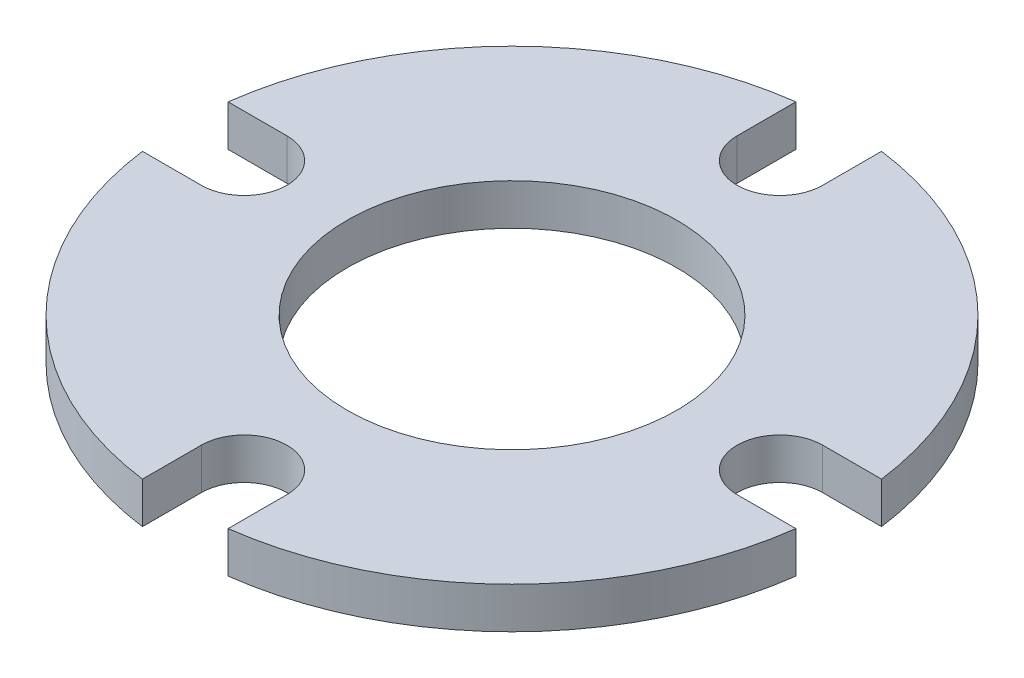
ISO-10303-21;
HEADER;
FILE_DESCRIPTION(('STEP AP214'),'2;1');
FILE_NAME('part.step','',(''),(''),'','','');
FILE_SCHEMA(('AUTOMOTIVE_DESIGN { 1 0 10303 214 1 1 1 1 }'));
ENDSEC;
DATA;
#1=APPLICATION_CONTEXT('core data for automotive mechanical design processes');
#2=APPLICATION_PROTOCOL_DEFINITION('international standard','automotive_design',2000,#1);
#3=PRODUCT_CONTEXT('',#1,'mechanical');
#4=PRODUCT('Part','Part','',(#3));
#5=PRODUCT_RELATED_PRODUCT_CATEGORY('part','',(#4));
#6=PRODUCT_DEFINITION_FORMATION('','',#4);
#7=PRODUCT_DEFINITION_CONTEXT('part definition',#1,'design');
#8=PRODUCT_DEFINITION('design','',#6,#7);
#9=PRODUCT_DEFINITION_SHAPE('','',#8);
#10=(LENGTH_UNIT() NAMED_UNIT(*) SI_UNIT(.MILLI.,.METRE.));
#11=(NAMED_UNIT(*) PLANE_ANGLE_UNIT() SI_UNIT($,.RADIAN.));
#12=(NAMED_UNIT(*) SI_UNIT($,.STERADIAN.) SOLID_ANGLE_UNIT());
#13=UNCERTAINTY_MEASURE_WITH_UNIT(LENGTH_MEASURE(1.E-05),#10,'distance_accuracy_value','');
#14=(GEOMETRIC_REPRESENTATION_CONTEXT(3) GLOBAL_UNCERTAINTY_ASSIGNED_CONTEXT((#13)) GLOBAL_UNIT_ASSIGNED_CONTEXT((#10,
#11,#12)) REPRESENTATION_CONTEXT('',''));
#15=CARTESIAN_POINT('',(0.,0.,0.));
#16=DIRECTION('',(0.,0.,1.));
#17=DIRECTION('',(1.,0.,0.));
#18=AXIS2_PLACEMENT_3D('',#15,#16,#17);
#19=CARTESIAN_POINT('',(20.6502,1.5875,0.));
#20=DIRECTION('',(0.,-1.,0.));
#21=DIRECTION('',(0.,0.,-1.));
#22=AXIS2_PLACEMENT_3D('',#19,#20,#21);
#23=CYLINDRICAL_SURFACE('',#22,3.302);
#24=CARTESIAN_POINT('',(20.6502,-1.5875,0.));
#25=DIRECTION('',(0.,-1.,0.));
#26=DIRECTION('',(0.,0.,1.));
#27=AXIS2_PLACEMENT_3D('',#24,#25,#26);
#28=CIRCLE('',#27,3.302);
#29=CARTESIAN_POINT('',(20.6502,-1.5875,3.302));
#30=VERTEX_POINT('',#29);
#31=CARTESIAN_POINT('',(20.6502,-1.5875,-3.302));
#32=VERTEX_POINT('',#31);
#33=EDGE_CURVE('E183',#30,#32,#28,.T.);
#34=ORIENTED_EDGE('',*,*,#33,.T.);
#35=DIRECTION('',(0.,-1.,0.));
#36=VECTOR('',#35,1.);
#37=CARTESIAN_POINT('',(20.6502,1.5875,-3.302));
#38=LINE('',#37,#36);
#39=CARTESIAN_POINT('',(20.6502,1.5875,-3.302));
#40=VERTEX_POINT('',#39);
#41=EDGE_CURVE('E11',#40,#32,#38,.T.);
#42=ORIENTED_EDGE('',*,*,#41,.F.);
#43=CARTESIAN_POINT('',(20.6502,1.5875,0.));
#44=DIRECTION('',(0.,-1.,0.));
#45=DIRECTION('',(0.,0.,1.));
#46=AXIS2_PLACEMENT_3D('',#43,#44,#45);
#47=CIRCLE('',#46,3.302);
#48=CARTESIAN_POINT('',(20.6502,1.5875,3.302));
#49=VERTEX_POINT('',#48);
#50=EDGE_CURVE('E214',#49,#40,#47,.T.);
#51=ORIENTED_EDGE('',*,*,#50,.F.);
#52=DIRECTION('',(0.,-1.,0.));
#53=VECTOR('',#52,1.);
#54=CARTESIAN_POINT('',(20.6502,1.5875,3.302));
#55=LINE('',#54,#53);
#56=EDGE_CURVE('E179',#49,#30,#55,.T.);
#57=ORIENTED_EDGE('',*,*,#56,.T.);
#58=EDGE_LOOP('',(#34,#42,#51,#57));
#59=FACE_BOUND('',#58,.T.);
#60=ADVANCED_FACE('F39',(#59),#23,.F.);
#61=CARTESIAN_POINT('',(20.6502,1.5875,-3.302));
#62=DIRECTION('',(0.,0.,-1.));
#63=DIRECTION('',(-1.,0.,0.));
#64=AXIS2_PLACEMENT_3D('',#61,#62,#63);
#65=PLANE('',#64);
#66=DIRECTION('',(1.,0.,0.));
#67=VECTOR('',#66,1.);
#68=CARTESIAN_POINT('',(20.6502,-1.5875,-3.302));
#69=LINE('',#68,#67);
#70=CARTESIAN_POINT('',(25.1844554437852,-1.5875,-3.302));
#71=VERTEX_POINT('',#70);
#72=EDGE_CURVE('E186',#32,#71,#69,.T.);
#73=ORIENTED_EDGE('',*,*,#72,.T.);
#74=DIRECTION('',(0.,-1.,0.));
#75=VECTOR('',#74,1.);
#76=CARTESIAN_POINT('',(25.1844554437852,1.5875,-3.302));
#77=LINE('',#76,#75);
#78=CARTESIAN_POINT('',(25.1844554437852,1.5875,-3.302));
#79=VERTEX_POINT('',#78);
#80=EDGE_CURVE('E47',#79,#71,#77,.T.);
#81=ORIENTED_EDGE('',*,*,#80,.F.);
#82=DIRECTION('',(1.,0.,0.));
#83=VECTOR('',#82,1.);
#84=CARTESIAN_POINT('',(20.6502,1.5875,-3.302));
#85=LINE('',#84,#83);
#86=EDGE_CURVE('E122',#40,#79,#85,.T.);
#87=ORIENTED_EDGE('',*,*,#86,.F.);
#88=ORIENTED_EDGE('',*,*,#41,.T.);
#89=EDGE_LOOP('',(#73,#81,#87,#88));
#90=FACE_BOUND('',#89,.T.);
#91=ADVANCED_FACE('F313',(#90),#65,.F.);
#92=CARTESIAN_POINT('',(0.,1.5875,0.));
#93=DIRECTION('',(0.,-1.,0.));
#94=DIRECTION('',(0.,0.,-1.));
#95=AXIS2_PLACEMENT_3D('',#92,#93,#94);
#96=CYLINDRICAL_SURFACE('',#95,25.4);
#97=CARTESIAN_POINT('',(0.,-1.5875,0.));
#98=DIRECTION('',(0.,1.,0.));
#99=DIRECTION('',(0.,0.,1.));
#100=AXIS2_PLACEMENT_3D('',#97,#98,#99);
#101=CIRCLE('',#100,25.4);
#102=CARTESIAN_POINT('',(3.302,-1.5875,-25.1844554437852));
#103=VERTEX_POINT('',#102);
#104=EDGE_CURVE('E189',#71,#103,#101,.T.);
#105=ORIENTED_EDGE('',*,*,#104,.T.);
#106=DIRECTION('',(0.,-1.,0.));
#107=VECTOR('',#106,1.);
#108=CARTESIAN_POINT('',(3.302,1.5875,-25.1844554437852));
#109=LINE('',#108,#107);
#110=CARTESIAN_POINT('',(3.302,1.5875,-25.1844554437852));
#111=VERTEX_POINT('',#110);
#112=EDGE_CURVE('E245',#111,#103,#109,.T.);
#113=ORIENTED_EDGE('',*,*,#112,.F.);
#114=CARTESIAN_POINT('',(0.,1.5875,0.));
#115=DIRECTION('',(0.,1.,0.));
#116=DIRECTION('',(0.,0.,1.));
#117=AXIS2_PLACEMENT_3D('',#114,#115,#116);
#118=CIRCLE('',#117,25.4);
#119=EDGE_CURVE('E253',#79,#111,#118,.T.);
#120=ORIENTED_EDGE('',*,*,#119,.F.);
#121=ORIENTED_EDGE('',*,*,#80,.T.);
#122=EDGE_LOOP('',(#105,#113,#120,#121));
#123=FACE_BOUND('',#122,.T.);
#124=ADVANCED_FACE('F251',(#123),#96,.T.);
#125=CARTESIAN_POINT('',(3.302,1.5875,-20.6502));
#126=DIRECTION('',(1.,0.,0.));
#127=DIRECTION('',(0.,0.,-1.));
#128=AXIS2_PLACEMENT_3D('',#125,#126,#127);
#129=PLANE('',#128);
#130=DIRECTION('',(0.,0.,1.));
#131=VECTOR('',#130,1.);
#132=CARTESIAN_POINT('',(3.302,-1.5875,-20.6502));
#133=LINE('',#132,#131);
#134=CARTESIAN_POINT('',(3.302,-1.5875,-20.6502));
#135=VERTEX_POINT('',#134);
#136=EDGE_CURVE('E191',#103,#135,#133,.T.);
#137=ORIENTED_EDGE('',*,*,#136,.T.);
#138=DIRECTION('',(0.,-1.,0.));
#139=VECTOR('',#138,1.);
#140=CARTESIAN_POINT('',(3.302,1.5875,-20.6502));
#141=LINE('',#140,#139);
#142=CARTESIAN_POINT('',(3.302,1.5875,-20.6502));
#143=VERTEX_POINT('',#142);
#144=EDGE_CURVE('E242',#143,#135,#141,.T.);
#145=ORIENTED_EDGE('',*,*,#144,.F.);
#146=DIRECTION('',(0.,0.,1.));
#147=VECTOR('',#146,1.);
#148=CARTESIAN_POINT('',(3.302,1.5875,-20.6502));
#149=LINE('',#148,#147);
#150=EDGE_CURVE('E271',#111,#143,#149,.T.);
#151=ORIENTED_EDGE('',*,*,#150,.F.);
#152=ORIENTED_EDGE('',*,*,#112,.T.);
#153=EDGE_LOOP('',(#137,#145,#151,#152));
#154=FACE_BOUND('',#153,.T.);
#155=ADVANCED_FACE('F262',(#154),#129,.F.);
#156=CARTESIAN_POINT('',(0.,1.5875,-20.6502));
#157=DIRECTION('',(0.,-1.,0.));
#158=DIRECTION('',(0.,0.,-1.));
#159=AXIS2_PLACEMENT_3D('',#156,#157,#158);
#160=CYLINDRICAL_SURFACE('',#159,3.302);
#161=CARTESIAN_POINT('',(0.,-1.5875,-20.6502));
#162=DIRECTION('',(0.,-1.,0.));
#163=DIRECTION('',(0.,0.,1.));
#164=AXIS2_PLACEMENT_3D('',#161,#162,#163);
#165=CIRCLE('',#164,3.302);
#166=CARTESIAN_POINT('',(-3.302,-1.5875,-20.6502));
#167=VERTEX_POINT('',#166);
#168=EDGE_CURVE('E193',#135,#167,#165,.T.);
#169=ORIENTED_EDGE('',*,*,#168,.T.);
#170=DIRECTION('',(0.,-1.,0.));
#171=VECTOR('',#170,1.);
#172=CARTESIAN_POINT('',(-3.302,1.5875,-20.6502));
#173=LINE('',#172,#171);
#174=CARTESIAN_POINT('',(-3.302,1.5875,-20.6502));
#175=VERTEX_POINT('',#174);
#176=EDGE_CURVE('E239',#175,#167,#173,.T.);
#177=ORIENTED_EDGE('',*,*,#176,.F.);
#178=CARTESIAN_POINT('',(0.,1.5875,-20.6502));
#179=DIRECTION('',(0.,-1.,0.));
#180=DIRECTION('',(0.,0.,1.));
#181=AXIS2_PLACEMENT_3D('',#178,#179,#180);
#182=CIRCLE('',#181,3.302);
#183=EDGE_CURVE('E268',#143,#175,#182,.T.);
#184=ORIENTED_EDGE('',*,*,#183,.F.);
#185=ORIENTED_EDGE('',*,*,#144,.T.);
#186=EDGE_LOOP('',(#169,#177,#184,#185));
#187=FACE_BOUND('',#186,.T.);
#188=ADVANCED_FACE('F266',(#187),#160,.F.);
#189=CARTESIAN_POINT('',(-3.302,1.5875,-20.6502));
#190=DIRECTION('',(-1.,0.,0.));
#191=DIRECTION('',(0.,0.,1.));
#192=AXIS2_PLACEMENT_3D('',#189,#190,#191);
#193=PLANE('',#192);
#194=DIRECTION('',(0.,0.,-1.));
#195=VECTOR('',#194,1.);
#196=CARTESIAN_POINT('',(-3.302,-1.5875,-20.6502));
#197=LINE('',#196,#195);
#198=CARTESIAN_POINT('',(-3.302,-1.5875,-25.1844554437852));
#199=VERTEX_POINT('',#198);
#200=EDGE_CURVE('E195',#167,#199,#197,.T.);
#201=ORIENTED_EDGE('',*,*,#200,.T.);
#202=DIRECTION('',(0.,-1.,0.));
#203=VECTOR('',#202,1.);
#204=CARTESIAN_POINT('',(-3.302,1.5875,-25.1844554437852));
#205=LINE('',#204,#203);
#206=CARTESIAN_POINT('',(-3.302,1.5875,-25.1844554437852));
#207=VERTEX_POINT('',#206);
#208=EDGE_CURVE('E236',#207,#199,#205,.T.);
#209=ORIENTED_EDGE('',*,*,#208,.F.);
#210=DIRECTION('',(0.,0.,-1.));
#211=VECTOR('',#210,1.);
#212=CARTESIAN_POINT('',(-3.302,1.5875,-20.6502));
#213=LINE('',#212,#211);
#214=EDGE_CURVE('E270',#175,#207,#213,.T.);
#215=ORIENTED_EDGE('',*,*,#214,.F.);
#216=ORIENTED_EDGE('',*,*,#176,.T.);
#217=EDGE_LOOP('',(#201,#209,#215,#216));
#218=FACE_BOUND('',#217,.T.);
#219=ADVANCED_FACE('F326',(#218),#193,.F.);
#220=CARTESIAN_POINT('',(0.,1.5875,0.));
#221=DIRECTION('',(0.,-1.,0.));
#222=DIRECTION('',(0.,0.,-1.));
#223=AXIS2_PLACEMENT_3D('',#220,#221,#222);
#224=CYLINDRICAL_SURFACE('',#223,25.4);
#225=CARTESIAN_POINT('',(0.,-1.5875,0.));
#226=DIRECTION('',(0.,1.,0.));
#227=DIRECTION('',(0.,0.,1.));
#228=AXIS2_PLACEMENT_3D('',#225,#226,#227);
#229=CIRCLE('',#228,25.4);
#230=CARTESIAN_POINT('',(-25.1844554437852,-1.5875,-3.302));
#231=VERTEX_POINT('',#230);
#232=EDGE_CURVE('E197',#199,#231,#229,.T.);
#233=ORIENTED_EDGE('',*,*,#232,.T.);
#234=DIRECTION('',(0.,-1.,0.));
#235=VECTOR('',#234,1.);
#236=CARTESIAN_POINT('',(-25.1844554437852,1.5875,-3.302));
#237=LINE('',#236,#235);
#238=CARTESIAN_POINT('',(-25.1844554437852,1.5875,-3.302));
#239=VERTEX_POINT('',#238);
#240=EDGE_CURVE('E233',#239,#231,#237,.T.);
#241=ORIENTED_EDGE('',*,*,#240,.F.);
#242=CARTESIAN_POINT('',(0.,1.5875,0.));
#243=DIRECTION('',(0.,1.,0.));
#244=DIRECTION('',(0.,0.,1.));
#245=AXIS2_PLACEMENT_3D('',#242,#243,#244);
#246=CIRCLE('',#245,25.4);
#247=EDGE_CURVE('E273',#207,#239,#246,.T.);
#248=ORIENTED_EDGE('',*,*,#247,.F.);
#249=ORIENTED_EDGE('',*,*,#208,.T.);
#250=EDGE_LOOP('',(#233,#241,#248,#249));
#251=FACE_BOUND('',#250,.T.);
#252=ADVANCED_FACE('F329',(#251),#224,.T.);
#253=CARTESIAN_POINT('',(-20.6502,1.5875,-3.302));
#254=DIRECTION('',(0.,0.,-1.));
#255=DIRECTION('',(-1.,0.,0.));
#256=AXIS2_PLACEMENT_3D('',#253,#254,#255);
#257=PLANE('',#256);
#258=DIRECTION('',(1.,0.,0.));
#259=VECTOR('',#258,1.);
#260=CARTESIAN_POINT('',(-20.6502,-1.5875,-3.302));
#261=LINE('',#260,#259);
#262=CARTESIAN_POINT('',(-20.6502,-1.5875,-3.302));
#263=VERTEX_POINT('',#262);
#264=EDGE_CURVE('E199',#231,#263,#261,.T.);
#265=ORIENTED_EDGE('',*,*,#264,.T.);
#266=DIRECTION('',(0.,-1.,0.));
#267=VECTOR('',#266,1.);
#268=CARTESIAN_POINT('',(-20.6502,1.5875,-3.302));
#269=LINE('',#268,#267);
#270=CARTESIAN_POINT('',(-20.6502,1.5875,-3.302));
#271=VERTEX_POINT('',#270);
#272=EDGE_CURVE('E230',#271,#263,#269,.T.);
#273=ORIENTED_EDGE('',*,*,#272,.F.);
#274=DIRECTION('',(1.,0.,0.));
#275=VECTOR('',#274,1.);
#276=CARTESIAN_POINT('',(-20.6502,1.5875,-3.302));
#277=LINE('',#276,#275);
#278=EDGE_CURVE('E279',#239,#271,#277,.T.);
#279=ORIENTED_EDGE('',*,*,#278,.F.);
#280=ORIENTED_EDGE('',*,*,#240,.T.);
#281=EDGE_LOOP('',(#265,#273,#279,#280));
#282=FACE_BOUND('',#281,.T.);
#283=ADVANCED_FACE('F333',(#282),#257,.F.);
#284=CARTESIAN_POINT('',(-20.6502,1.5875,0.));
#285=DIRECTION('',(0.,-1.,0.));
#286=DIRECTION('',(0.,0.,-1.));
#287=AXIS2_PLACEMENT_3D('',#284,#285,#286);
#288=CYLINDRICAL_SURFACE('',#287,3.302);
#289=CARTESIAN_POINT('',(-20.6502,-1.5875,0.));
#290=DIRECTION('',(0.,-1.,0.));
#291=DIRECTION('',(0.,0.,1.));
#292=AXIS2_PLACEMENT_3D('',#289,#290,#291);
#293=CIRCLE('',#292,3.302);
#294=CARTESIAN_POINT('',(-20.6502,-1.5875,3.302));
#295=VERTEX_POINT('',#294);
#296=EDGE_CURVE('E201',#263,#295,#293,.T.);
#297=ORIENTED_EDGE('',*,*,#296,.T.);
#298=DIRECTION('',(0.,-1.,0.));
#299=VECTOR('',#298,1.);
#300=CARTESIAN_POINT('',(-20.6502,1.5875,3.302));
#301=LINE('',#300,#299);
#302=CARTESIAN_POINT('',(-20.6502,1.5875,3.302));
#303=VERTEX_POINT('',#302);
#304=EDGE_CURVE('E227',#303,#295,#301,.T.);
#305=ORIENTED_EDGE('',*,*,#304,.F.);
#306=CARTESIAN_POINT('',(-20.6502,1.5875,0.));
#307=DIRECTION('',(0.,-1.,0.));
#308=DIRECTION('',(0.,0.,1.));
#309=AXIS2_PLACEMENT_3D('',#306,#307,#308);
#310=CIRCLE('',#309,3.302);
#311=EDGE_CURVE('E281',#271,#303,#310,.T.);
#312=ORIENTED_EDGE('',*,*,#311,.F.);
#313=ORIENTED_EDGE('',*,*,#272,.T.);
#314=EDGE_LOOP('',(#297,#305,#312,#313));
#315=FACE_BOUND('',#314,.T.);
#316=ADVANCED_FACE('F337',(#315),#288,.F.);
#317=CARTESIAN_POINT('',(-20.6502,1.5875,3.302));
#318=DIRECTION('',(0.,0.,1.));
#319=DIRECTION('',(1.,0.,0.));
#320=AXIS2_PLACEMENT_3D('',#317,#318,#319);
#321=PLANE('',#320);
#322=DIRECTION('',(-1.,0.,0.));
#323=VECTOR('',#322,1.);
#324=CARTESIAN_POINT('',(-20.6502,-1.5875,3.302));
#325=LINE('',#324,#323);
#326=CARTESIAN_POINT('',(-25.1844554437852,-1.5875,3.30200000000001));
#327=VERTEX_POINT('',#326);
#328=EDGE_CURVE('E203',#295,#327,#325,.T.);
#329=ORIENTED_EDGE('',*,*,#328,.T.);
#330=DIRECTION('',(0.,-1.,0.));
#331=VECTOR('',#330,1.);
#332=CARTESIAN_POINT('',(-25.1844554437852,1.5875,3.30200000000001));
#333=LINE('',#332,#331);
#334=CARTESIAN_POINT('',(-25.1844554437852,1.5875,3.30200000000001));
#335=VERTEX_POINT('',#334);
#336=EDGE_CURVE('E224',#335,#327,#333,.T.);
#337=ORIENTED_EDGE('',*,*,#336,.F.);
#338=DIRECTION('',(-1.,0.,0.));
#339=VECTOR('',#338,1.);
#340=CARTESIAN_POINT('',(-20.6502,1.5875,3.302));
#341=LINE('',#340,#339);
#342=EDGE_CURVE('E283',#303,#335,#341,.T.);
#343=ORIENTED_EDGE('',*,*,#342,.F.);
#344=ORIENTED_EDGE('',*,*,#304,.T.);
#345=EDGE_LOOP('',(#329,#337,#343,#344));
#346=FACE_BOUND('',#345,.T.);
#347=ADVANCED_FACE('F341',(#346),#321,.F.);
#348=CARTESIAN_POINT('',(0.,1.5875,0.));
#349=DIRECTION('',(0.,-1.,0.));
#350=DIRECTION('',(0.,0.,-1.));
#351=AXIS2_PLACEMENT_3D('',#348,#349,#350);
#352=CYLINDRICAL_SURFACE('',#351,25.4);
#353=CARTESIAN_POINT('',(0.,-1.5875,0.));
#354=DIRECTION('',(0.,1.,0.));
#355=DIRECTION('',(0.,0.,1.));
#356=AXIS2_PLACEMENT_3D('',#353,#354,#355);
#357=CIRCLE('',#356,25.4);
#358=CARTESIAN_POINT('',(-3.302,-1.5875,25.1844554437852));
#359=VERTEX_POINT('',#358);
#360=EDGE_CURVE('E205',#327,#359,#357,.T.);
#361=ORIENTED_EDGE('',*,*,#360,.T.);
#362=DIRECTION('',(0.,-1.,0.));
#363=VECTOR('',#362,1.);
#364=CARTESIAN_POINT('',(-3.302,1.5875,25.1844554437852));
#365=LINE('',#364,#363);
#366=CARTESIAN_POINT('',(-3.302,1.5875,25.1844554437852));
#367=VERTEX_POINT('',#366);
#368=EDGE_CURVE('E221',#367,#359,#365,.T.);
#369=ORIENTED_EDGE('',*,*,#368,.F.);
#370=CARTESIAN_POINT('',(0.,1.5875,0.));
#371=DIRECTION('',(0.,1.,0.));
#372=DIRECTION('',(0.,0.,1.));
#373=AXIS2_PLACEMENT_3D('',#370,#371,#372);
#374=CIRCLE('',#373,25.4);
#375=EDGE_CURVE('E285',#335,#367,#374,.T.);
#376=ORIENTED_EDGE('',*,*,#375,.F.);
#377=ORIENTED_EDGE('',*,*,#336,.T.);
#378=EDGE_LOOP('',(#361,#369,#376,#377));
#379=FACE_BOUND('',#378,.T.);
#380=ADVANCED_FACE('F345',(#379),#352,.T.);
#381=CARTESIAN_POINT('',(-3.302,1.5875,20.6502));
#382=DIRECTION('',(-1.,0.,0.));
#383=DIRECTION('',(0.,0.,1.));
#384=AXIS2_PLACEMENT_3D('',#381,#382,#383);
#385=PLANE('',#384);
#386=DIRECTION('',(0.,0.,-1.));
#387=VECTOR('',#386,1.);
#388=CARTESIAN_POINT('',(-3.302,-1.5875,20.6502));
#389=LINE('',#388,#387);
#390=CARTESIAN_POINT('',(-3.302,-1.5875,20.6502));
#391=VERTEX_POINT('',#390);
#392=EDGE_CURVE('E207',#359,#391,#389,.T.);
#393=ORIENTED_EDGE('',*,*,#392,.T.);
#394=DIRECTION('',(0.,-1.,0.));
#395=VECTOR('',#394,1.);
#396=CARTESIAN_POINT('',(-3.302,1.5875,20.6502));
#397=LINE('',#396,#395);
#398=CARTESIAN_POINT('',(-3.302,1.5875,20.6502));
#399=VERTEX_POINT('',#398);
#400=EDGE_CURVE('E218',#399,#391,#397,.T.);
#401=ORIENTED_EDGE('',*,*,#400,.F.);
#402=DIRECTION('',(0.,0.,-1.));
#403=VECTOR('',#402,1.);
#404=CARTESIAN_POINT('',(-3.302,1.5875,20.6502));
#405=LINE('',#404,#403);
#406=EDGE_CURVE('E287',#367,#399,#405,.T.);
#407=ORIENTED_EDGE('',*,*,#406,.F.);
#408=ORIENTED_EDGE('',*,*,#368,.T.);
#409=EDGE_LOOP('',(#393,#401,#407,#408));
#410=FACE_BOUND('',#409,.T.);
#411=ADVANCED_FACE('F293',(#410),#385,.F.);
#412=CARTESIAN_POINT('',(0.,1.5875,20.6502));
#413=DIRECTION('',(0.,-1.,0.));
#414=DIRECTION('',(0.,0.,-1.));
#415=AXIS2_PLACEMENT_3D('',#412,#413,#414);
#416=CYLINDRICAL_SURFACE('',#415,3.302);
#417=CARTESIAN_POINT('',(0.,-1.5875,20.6502));
#418=DIRECTION('',(0.,-1.,0.));
#419=DIRECTION('',(0.,0.,1.));
#420=AXIS2_PLACEMENT_3D('',#417,#418,#419);
#421=CIRCLE('',#420,3.302);
#422=CARTESIAN_POINT('',(3.302,-1.5875,20.6502));
#423=VERTEX_POINT('',#422);
#424=EDGE_CURVE('E209',#391,#423,#421,.T.);
#425=ORIENTED_EDGE('',*,*,#424,.T.);
#426=DIRECTION('',(0.,-1.,0.));
#427=VECTOR('',#426,1.);
#428=CARTESIAN_POINT('',(3.302,1.5875,20.6502));
#429=LINE('',#428,#427);
#430=CARTESIAN_POINT('',(3.302,1.5875,20.6502));
#431=VERTEX_POINT('',#430);
#432=EDGE_CURVE('E174',#431,#423,#429,.T.);
#433=ORIENTED_EDGE('',*,*,#432,.F.);
#434=CARTESIAN_POINT('',(0.,1.5875,20.6502));
#435=DIRECTION('',(0.,-1.,0.));
#436=DIRECTION('',(0.,0.,1.));
#437=AXIS2_PLACEMENT_3D('',#434,#435,#436);
#438=CIRCLE('',#437,3.302);
#439=EDGE_CURVE('E165',#399,#431,#438,.T.);
#440=ORIENTED_EDGE('',*,*,#439,.F.);
#441=ORIENTED_EDGE('',*,*,#400,.T.);
#442=EDGE_LOOP('',(#425,#433,#440,#441));
#443=FACE_BOUND('',#442,.T.);
#444=ADVANCED_FACE('F297',(#443),#416,.F.);
#445=CARTESIAN_POINT('',(3.302,1.5875,20.6502));
#446=DIRECTION('',(1.,0.,0.));
#447=DIRECTION('',(0.,0.,-1.));
#448=AXIS2_PLACEMENT_3D('',#445,#446,#447);
#449=PLANE('',#448);
#450=DIRECTION('',(0.,0.,1.));
#451=VECTOR('',#450,1.);
#452=CARTESIAN_POINT('',(3.302,-1.5875,20.6502));
#453=LINE('',#452,#451);
#454=CARTESIAN_POINT('',(3.302,-1.5875,25.1844554437852));
#455=VERTEX_POINT('',#454);
#456=EDGE_CURVE('E173',#423,#455,#453,.T.);
#457=ORIENTED_EDGE('',*,*,#456,.T.);
#458=DIRECTION('',(0.,-1.,0.));
#459=VECTOR('',#458,1.);
#460=CARTESIAN_POINT('',(3.302,1.5875,25.1844554437852));
#461=LINE('',#460,#459);
#462=CARTESIAN_POINT('',(3.302,1.5875,25.1844554437852));
#463=VERTEX_POINT('',#462);
#464=EDGE_CURVE('E170',#463,#455,#461,.T.);
#465=ORIENTED_EDGE('',*,*,#464,.F.);
#466=DIRECTION('',(0.,0.,1.));
#467=VECTOR('',#466,1.);
#468=CARTESIAN_POINT('',(3.302,1.5875,20.6502));
#469=LINE('',#468,#467);
#470=EDGE_CURVE('E159',#431,#463,#469,.T.);
#471=ORIENTED_EDGE('',*,*,#470,.F.);
#472=ORIENTED_EDGE('',*,*,#432,.T.);
#473=EDGE_LOOP('',(#457,#465,#471,#472));
#474=FACE_BOUND('',#473,.T.);
#475=ADVANCED_FACE('F171',(#474),#449,.F.);
#476=CARTESIAN_POINT('',(0.,1.5875,0.));
#477=DIRECTION('',(0.,-1.,0.));
#478=DIRECTION('',(0.,0.,-1.));
#479=AXIS2_PLACEMENT_3D('',#476,#477,#478);
#480=CYLINDRICAL_SURFACE('',#479,25.4);
#481=CARTESIAN_POINT('',(0.,-1.5875,0.));
#482=DIRECTION('',(0.,1.,0.));
#483=DIRECTION('',(0.,0.,1.));
#484=AXIS2_PLACEMENT_3D('',#481,#482,#483);
#485=CIRCLE('',#484,25.4);
#486=CARTESIAN_POINT('',(25.1844554437852,-1.5875,3.302));
#487=VERTEX_POINT('',#486);
#488=EDGE_CURVE('E108',#455,#487,#485,.T.);
#489=ORIENTED_EDGE('',*,*,#488,.T.);
#490=DIRECTION('',(0.,-1.,0.));
#491=VECTOR('',#490,1.);
#492=CARTESIAN_POINT('',(25.1844554437852,1.5875,3.302));
#493=LINE('',#492,#491);
#494=CARTESIAN_POINT('',(25.1844554437852,1.5875,3.302));
#495=VERTEX_POINT('',#494);
#496=EDGE_CURVE('E175',#495,#487,#493,.T.);
#497=ORIENTED_EDGE('',*,*,#496,.F.);
#498=CARTESIAN_POINT('',(0.,1.5875,0.));
#499=DIRECTION('',(0.,1.,0.));
#500=DIRECTION('',(0.,0.,1.));
#501=AXIS2_PLACEMENT_3D('',#498,#499,#500);
#502=CIRCLE('',#501,25.4);
#503=EDGE_CURVE('E163',#463,#495,#502,.T.);
#504=ORIENTED_EDGE('',*,*,#503,.F.);
#505=ORIENTED_EDGE('',*,*,#464,.T.);
#506=EDGE_LOOP('',(#489,#497,#504,#505));
#507=FACE_BOUND('',#506,.T.);
#508=ADVANCED_FACE('F177',(#507),#480,.T.);
#509=CARTESIAN_POINT('',(20.6502,1.5875,3.302));
#510=DIRECTION('',(0.,0.,1.));
#511=DIRECTION('',(1.,0.,0.));
#512=AXIS2_PLACEMENT_3D('',#509,#510,#511);
#513=PLANE('',#512);
#514=DIRECTION('',(-1.,0.,0.));
#515=VECTOR('',#514,1.);
#516=CARTESIAN_POINT('',(20.6502,-1.5875,3.302));
#517=LINE('',#516,#515);
#518=EDGE_CURVE('E114',#487,#30,#517,.T.);
#519=ORIENTED_EDGE('',*,*,#518,.T.);
#520=ORIENTED_EDGE('',*,*,#56,.F.);
#521=DIRECTION('',(-1.,0.,0.));
#522=VECTOR('',#521,1.);
#523=CARTESIAN_POINT('',(20.6502,1.5875,3.302));
#524=LINE('',#523,#522);
#525=EDGE_CURVE('E55',#495,#49,#524,.T.);
#526=ORIENTED_EDGE('',*,*,#525,.F.);
#527=ORIENTED_EDGE('',*,*,#496,.T.);
#528=EDGE_LOOP('',(#519,#520,#526,#527));
#529=FACE_BOUND('',#528,.T.);
#530=ADVANCED_FACE('F301',(#529),#513,.F.);
#531=CARTESIAN_POINT('',(20.6502,1.5875,0.));
#532=DIRECTION('',(0.,1.,0.));
#533=DIRECTION('',(0.,0.,1.));
#534=AXIS2_PLACEMENT_3D('',#531,#532,#533);
#535=PLANE('',#534);
#536=CARTESIAN_POINT('',(0.,1.5875,0.));
#537=DIRECTION('',(0.,1.,0.));
#538=DIRECTION('',(0.,0.,1.));
#539=AXIS2_PLACEMENT_3D('',#536,#537,#538);
#540=CIRCLE('',#539,12.7);
#541=CARTESIAN_POINT('',(0.,1.5875,12.7));
#542=VERTEX_POINT('',#541);
#543=EDGE_CURVE('E401',#542,#542,#540,.T.);
#544=ORIENTED_EDGE('',*,*,#543,.F.);
#545=EDGE_LOOP('',(#544));
#546=FACE_BOUND('',#545,.T.);
#547=ORIENTED_EDGE('',*,*,#50,.T.);
#548=ORIENTED_EDGE('',*,*,#86,.T.);
#549=ORIENTED_EDGE('',*,*,#119,.T.);
#550=ORIENTED_EDGE('',*,*,#150,.T.);
#551=ORIENTED_EDGE('',*,*,#183,.T.);
#552=ORIENTED_EDGE('',*,*,#214,.T.);
#553=ORIENTED_EDGE('',*,*,#247,.T.);
#554=ORIENTED_EDGE('',*,*,#278,.T.);
#555=ORIENTED_EDGE('',*,*,#311,.T.);
#556=ORIENTED_EDGE('',*,*,#342,.T.);
#557=ORIENTED_EDGE('',*,*,#375,.T.);
#558=ORIENTED_EDGE('',*,*,#406,.T.);
#559=ORIENTED_EDGE('',*,*,#439,.T.);
#560=ORIENTED_EDGE('',*,*,#470,.T.);
#561=ORIENTED_EDGE('',*,*,#503,.T.);
#562=ORIENTED_EDGE('',*,*,#525,.T.);
#563=EDGE_LOOP('',(#547,#548,#549,#550,#551,#552,#553,#554,#555,#556,#557,#558,#559,#560,#561,#562));
#564=FACE_BOUND('',#563,.T.);
#565=ADVANCED_FACE('F161',(#546,#564),#535,.T.);
#566=CARTESIAN_POINT('',(20.6502,-1.5875,0.));
#567=DIRECTION('',(0.,1.,0.));
#568=DIRECTION('',(0.,0.,1.));
#569=AXIS2_PLACEMENT_3D('',#566,#567,#568);
#570=PLANE('',#569);
#571=CARTESIAN_POINT('',(0.,-1.5875,0.));
#572=DIRECTION('',(0.,1.,0.));
#573=DIRECTION('',(0.,0.,1.));
#574=AXIS2_PLACEMENT_3D('',#571,#572,#573);
#575=CIRCLE('',#574,12.7);
#576=CARTESIAN_POINT('',(0.,-1.5875,12.7));
#577=VERTEX_POINT('',#576);
#578=EDGE_CURVE('E187',#577,#577,#575,.T.);
#579=ORIENTED_EDGE('',*,*,#578,.T.);
#580=EDGE_LOOP('',(#579));
#581=FACE_BOUND('',#580,.T.);
#582=ORIENTED_EDGE('',*,*,#33,.F.);
#583=ORIENTED_EDGE('',*,*,#518,.F.);
#584=ORIENTED_EDGE('',*,*,#488,.F.);
#585=ORIENTED_EDGE('',*,*,#456,.F.);
#586=ORIENTED_EDGE('',*,*,#424,.F.);
#587=ORIENTED_EDGE('',*,*,#392,.F.);
#588=ORIENTED_EDGE('',*,*,#360,.F.);
#589=ORIENTED_EDGE('',*,*,#328,.F.);
#590=ORIENTED_EDGE('',*,*,#296,.F.);
#591=ORIENTED_EDGE('',*,*,#264,.F.);
#592=ORIENTED_EDGE('',*,*,#232,.F.);
#593=ORIENTED_EDGE('',*,*,#200,.F.);
#594=ORIENTED_EDGE('',*,*,#168,.F.);
#595=ORIENTED_EDGE('',*,*,#136,.F.);
#596=ORIENTED_EDGE('',*,*,#104,.F.);
#597=ORIENTED_EDGE('',*,*,#72,.F.);
#598=EDGE_LOOP('',(#582,#583,#584,#585,#586,#587,#588,#589,#590,#591,#592,#593,#594,#595,#596,#597));
#599=FACE_BOUND('',#598,.T.);
#600=ADVANCED_FACE('F257',(#581,#599),#570,.F.);
#601=CARTESIAN_POINT('',(0.,1.5875,0.));
#602=DIRECTION('',(0.,1.,0.));
#603=DIRECTION('',(0.,0.,1.));
#604=AXIS2_PLACEMENT_3D('',#601,#602,#603);
#605=CYLINDRICAL_SURFACE('',#604,12.7);
#606=ORIENTED_EDGE('',*,*,#578,.F.);
#607=EDGE_LOOP('',(#606));
#608=FACE_BOUND('',#607,.T.);
#609=ORIENTED_EDGE('',*,*,#543,.T.);
#610=EDGE_LOOP('',(#609));
#611=FACE_BOUND('',#610,.T.);
#612=ADVANCED_FACE('F384',(#608,#611),#605,.F.);
#613=CLOSED_SHELL('',(#60,#91,#124,#155,#188,#219,#252,#283,#316,#347,#380,#411,#444,#475,#508,
#530,#565,#600,#612));
#614=MANIFOLD_SOLID_BREP('B2',#613);
#615=ADVANCED_BREP_SHAPE_REPRESENTATION('',(#18,#614),#14);
#616=SHAPE_DEFINITION_REPRESENTATION(#9,#615);
ENDSEC;
END-ISO-10303-21;
